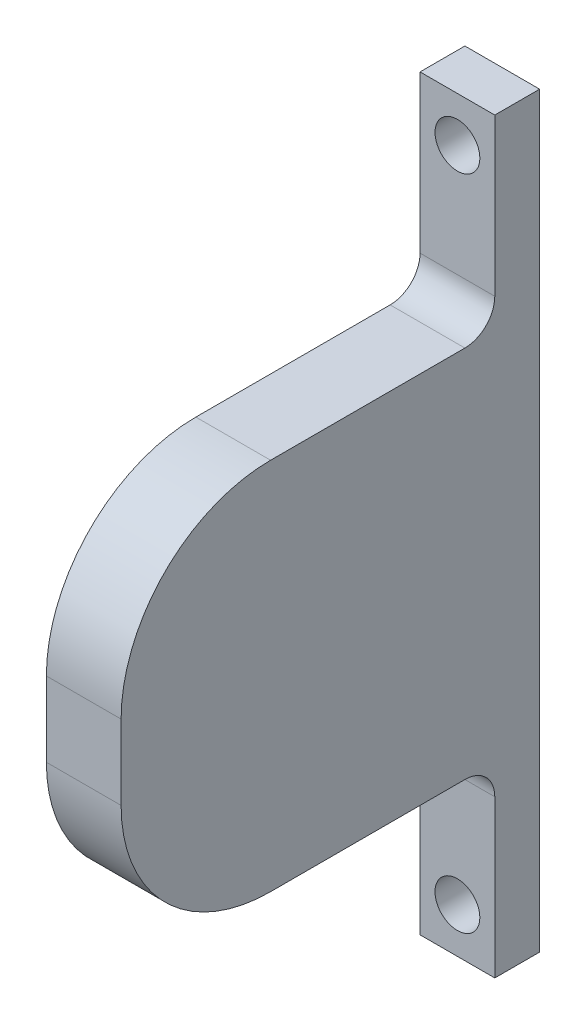
ISO-10303-21;
HEADER;
FILE_DESCRIPTION(('STEP AP214'),'2;1');
FILE_NAME('part.step','',(''),(''),'','','');
FILE_SCHEMA(('AUTOMOTIVE_DESIGN { 1 0 10303 214 1 1 1 1 }'));
ENDSEC;
DATA;
#1=APPLICATION_CONTEXT('core data for automotive mechanical design processes');
#2=APPLICATION_PROTOCOL_DEFINITION('international standard','automotive_design',2000,#1);
#3=PRODUCT_CONTEXT('',#1,'mechanical');
#4=PRODUCT('Part','Part','',(#3));
#5=PRODUCT_RELATED_PRODUCT_CATEGORY('part','',(#4));
#6=PRODUCT_DEFINITION_FORMATION('','',#4);
#7=PRODUCT_DEFINITION_CONTEXT('part definition',#1,'design');
#8=PRODUCT_DEFINITION('design','',#6,#7);
#9=PRODUCT_DEFINITION_SHAPE('','',#8);
#10=(LENGTH_UNIT() NAMED_UNIT(*) SI_UNIT(.MILLI.,.METRE.));
#11=(NAMED_UNIT(*) PLANE_ANGLE_UNIT() SI_UNIT($,.RADIAN.));
#12=(NAMED_UNIT(*) SI_UNIT($,.STERADIAN.) SOLID_ANGLE_UNIT());
#13=UNCERTAINTY_MEASURE_WITH_UNIT(LENGTH_MEASURE(1.E-05),#10,'distance_accuracy_value','');
#14=(GEOMETRIC_REPRESENTATION_CONTEXT(3) GLOBAL_UNCERTAINTY_ASSIGNED_CONTEXT((#13)) GLOBAL_UNIT_ASSIGNED_CONTEXT((#10,
#11,#12)) REPRESENTATION_CONTEXT('',''));
#15=CARTESIAN_POINT('',(0.,0.,0.));
#16=DIRECTION('',(0.,0.,1.));
#17=DIRECTION('',(1.,0.,0.));
#18=AXIS2_PLACEMENT_3D('',#15,#16,#17);
#19=CARTESIAN_POINT('',(5.,0.,0.));
#20=DIRECTION('',(0.,0.,-1.));
#21=DIRECTION('',(-1.,0.,0.));
#22=AXIS2_PLACEMENT_3D('',#19,#20,#21);
#23=PLANE('',#22);
#24=DIRECTION('',(0.,-1.,0.));
#25=VECTOR('',#24,1.);
#26=CARTESIAN_POINT('',(0.,0.,0.));
#27=LINE('',#26,#25);
#28=CARTESIAN_POINT('',(0.,15.,0.));
#29=VERTEX_POINT('',#28);
#30=CARTESIAN_POINT('',(0.,10.,0.));
#31=VERTEX_POINT('',#30);
#32=EDGE_CURVE('E173',#29,#31,#27,.T.);
#33=ORIENTED_EDGE('',*,*,#32,.T.);
#34=DIRECTION('',(-1.,0.,0.));
#35=VECTOR('',#34,1.);
#36=CARTESIAN_POINT('',(5.,10.,0.));
#37=LINE('',#36,#35);
#38=CARTESIAN_POINT('',(5.,10.,0.));
#39=VERTEX_POINT('',#38);
#40=EDGE_CURVE('E217',#31,#39,#37,.F.);
#41=ORIENTED_EDGE('',*,*,#40,.T.);
#42=DIRECTION('',(0.,-1.,0.));
#43=VECTOR('',#42,1.);
#44=CARTESIAN_POINT('',(5.,0.,0.));
#45=LINE('',#44,#43);
#46=CARTESIAN_POINT('',(5.,15.,0.));
#47=VERTEX_POINT('',#46);
#48=EDGE_CURVE('E191',#47,#39,#45,.T.);
#49=ORIENTED_EDGE('',*,*,#48,.F.);
#50=DIRECTION('',(-1.,0.,0.));
#51=VECTOR('',#50,1.);
#52=CARTESIAN_POINT('',(5.,15.,0.));
#53=LINE('',#52,#51);
#54=EDGE_CURVE('E214',#47,#29,#53,.T.);
#55=ORIENTED_EDGE('',*,*,#54,.T.);
#56=EDGE_LOOP('',(#33,#41,#49,#55));
#57=FACE_BOUND('',#56,.T.);
#58=ADVANCED_FACE('F45',(#57),#23,.F.);
#59=CARTESIAN_POINT('',(5.,0.,0.));
#60=DIRECTION('',(0.,1.,0.));
#61=DIRECTION('',(0.,0.,1.));
#62=AXIS2_PLACEMENT_3D('',#59,#60,#61);
#63=PLANE('',#62);
#64=DIRECTION('',(0.,0.,-1.));
#65=VECTOR('',#64,1.);
#66=CARTESIAN_POINT('',(0.,0.,0.));
#67=LINE('',#66,#65);
#68=CARTESIAN_POINT('',(0.,0.,-10.));
#69=VERTEX_POINT('',#68);
#70=CARTESIAN_POINT('',(0.,0.,-23.));
#71=VERTEX_POINT('',#70);
#72=EDGE_CURVE('E176',#69,#71,#67,.T.);
#73=ORIENTED_EDGE('',*,*,#72,.T.);
#74=DIRECTION('',(-1.,0.,0.));
#75=VECTOR('',#74,1.);
#76=CARTESIAN_POINT('',(5.,0.,-23.));
#77=LINE('',#76,#75);
#78=CARTESIAN_POINT('',(5.,0.,-23.));
#79=VERTEX_POINT('',#78);
#80=EDGE_CURVE('E228',#71,#79,#77,.F.);
#81=ORIENTED_EDGE('',*,*,#80,.T.);
#82=DIRECTION('',(0.,0.,-1.));
#83=VECTOR('',#82,1.);
#84=CARTESIAN_POINT('',(5.,0.,0.));
#85=LINE('',#84,#83);
#86=CARTESIAN_POINT('',(5.,0.,-10.));
#87=VERTEX_POINT('',#86);
#88=EDGE_CURVE('E146',#87,#79,#85,.T.);
#89=ORIENTED_EDGE('',*,*,#88,.F.);
#90=DIRECTION('',(-1.,0.,0.));
#91=VECTOR('',#90,1.);
#92=CARTESIAN_POINT('',(5.,0.,-10.));
#93=LINE('',#92,#91);
#94=EDGE_CURVE('E206',#87,#69,#93,.T.);
#95=ORIENTED_EDGE('',*,*,#94,.T.);
#96=EDGE_LOOP('',(#73,#81,#89,#95));
#97=FACE_BOUND('',#96,.T.);
#98=ADVANCED_FACE('F241',(#97),#63,.F.);
#99=CARTESIAN_POINT('',(5.,-12.5,-25.));
#100=DIRECTION('',(0.,0.,-1.));
#101=DIRECTION('',(-1.,0.,0.));
#102=AXIS2_PLACEMENT_3D('',#99,#100,#101);
#103=PLANE('',#102);
#104=CARTESIAN_POINT('',(2.5,-9.5,-25.));
#105=DIRECTION('',(0.,0.,1.));
#106=DIRECTION('',(-1.,0.,0.));
#107=AXIS2_PLACEMENT_3D('',#104,#105,#106);
#108=CIRCLE('',#107,1.5);
#109=CARTESIAN_POINT('',(1.,-9.5,-25.));
#110=VERTEX_POINT('',#109);
#111=EDGE_CURVE('E285',#110,#110,#108,.T.);
#112=ORIENTED_EDGE('',*,*,#111,.F.);
#113=EDGE_LOOP('',(#112));
#114=FACE_BOUND('',#113,.T.);
#115=DIRECTION('',(0.,-1.,0.));
#116=VECTOR('',#115,1.);
#117=CARTESIAN_POINT('',(5.,-12.5,-25.));
#118=LINE('',#117,#116);
#119=CARTESIAN_POINT('',(5.,-2.,-25.));
#120=VERTEX_POINT('',#119);
#121=CARTESIAN_POINT('',(5.,-12.5,-25.));
#122=VERTEX_POINT('',#121);
#123=EDGE_CURVE('E133',#120,#122,#118,.T.);
#124=ORIENTED_EDGE('',*,*,#123,.F.);
#125=DIRECTION('',(-1.,0.,0.));
#126=VECTOR('',#125,1.);
#127=CARTESIAN_POINT('',(0.,-2.,-25.));
#128=LINE('',#127,#126);
#129=CARTESIAN_POINT('',(0.,-2.,-25.));
#130=VERTEX_POINT('',#129);
#131=EDGE_CURVE('E226',#120,#130,#128,.T.);
#132=ORIENTED_EDGE('',*,*,#131,.T.);
#133=DIRECTION('',(0.,-1.,0.));
#134=VECTOR('',#133,1.);
#135=CARTESIAN_POINT('',(0.,-12.5,-25.));
#136=LINE('',#135,#134);
#137=CARTESIAN_POINT('',(0.,-12.5,-25.));
#138=VERTEX_POINT('',#137);
#139=EDGE_CURVE('E152',#130,#138,#136,.T.);
#140=ORIENTED_EDGE('',*,*,#139,.T.);
#141=DIRECTION('',(-1.,0.,0.));
#142=VECTOR('',#141,1.);
#143=CARTESIAN_POINT('',(5.,-12.5,-25.));
#144=LINE('',#143,#142);
#145=EDGE_CURVE('E149',#122,#138,#144,.T.);
#146=ORIENTED_EDGE('',*,*,#145,.F.);
#147=EDGE_LOOP('',(#124,#132,#140,#146));
#148=FACE_BOUND('',#147,.T.);
#149=ADVANCED_FACE('F150',(#114,#148),#103,.F.);
#150=CARTESIAN_POINT('',(5.,-12.5,-25.));
#151=DIRECTION('',(0.,1.,0.));
#152=DIRECTION('',(0.,0.,1.));
#153=AXIS2_PLACEMENT_3D('',#150,#151,#152);
#154=PLANE('',#153);
#155=DIRECTION('',(0.,0.,-1.));
#156=VECTOR('',#155,1.);
#157=CARTESIAN_POINT('',(0.,-12.5,-25.));
#158=LINE('',#157,#156);
#159=CARTESIAN_POINT('',(0.,-12.5,-28.));
#160=VERTEX_POINT('',#159);
#161=EDGE_CURVE('E181',#138,#160,#158,.T.);
#162=ORIENTED_EDGE('',*,*,#161,.T.);
#163=DIRECTION('',(-1.,0.,0.));
#164=VECTOR('',#163,1.);
#165=CARTESIAN_POINT('',(5.,-12.5,-28.));
#166=LINE('',#165,#164);
#167=CARTESIAN_POINT('',(5.,-12.5,-28.));
#168=VERTEX_POINT('',#167);
#169=EDGE_CURVE('E156',#168,#160,#166,.T.);
#170=ORIENTED_EDGE('',*,*,#169,.F.);
#171=DIRECTION('',(0.,0.,-1.));
#172=VECTOR('',#171,1.);
#173=CARTESIAN_POINT('',(5.,-12.5,-25.));
#174=LINE('',#173,#172);
#175=EDGE_CURVE('E138',#122,#168,#174,.T.);
#176=ORIENTED_EDGE('',*,*,#175,.F.);
#177=ORIENTED_EDGE('',*,*,#145,.T.);
#178=EDGE_LOOP('',(#162,#170,#176,#177));
#179=FACE_BOUND('',#178,.T.);
#180=ADVANCED_FACE('F158',(#179),#154,.F.);
#181=CARTESIAN_POINT('',(5.,-12.5,-28.));
#182=DIRECTION('',(0.,0.,1.));
#183=DIRECTION('',(1.,0.,0.));
#184=AXIS2_PLACEMENT_3D('',#181,#182,#183);
#185=PLANE('',#184);
#186=CARTESIAN_POINT('',(2.5,34.5,-28.));
#187=DIRECTION('',(0.,0.,1.));
#188=DIRECTION('',(1.,0.,0.));
#189=AXIS2_PLACEMENT_3D('',#186,#187,#188);
#190=CIRCLE('',#189,1.5);
#191=CARTESIAN_POINT('',(4.,34.5,-28.));
#192=VERTEX_POINT('',#191);
#193=EDGE_CURVE('E200',#192,#192,#190,.T.);
#194=ORIENTED_EDGE('',*,*,#193,.T.);
#195=EDGE_LOOP('',(#194));
#196=FACE_BOUND('',#195,.T.);
#197=CARTESIAN_POINT('',(2.5,-9.5,-28.));
#198=DIRECTION('',(0.,0.,1.));
#199=DIRECTION('',(1.,0.,0.));
#200=AXIS2_PLACEMENT_3D('',#197,#198,#199);
#201=CIRCLE('',#200,1.5);
#202=CARTESIAN_POINT('',(4.,-9.5,-28.));
#203=VERTEX_POINT('',#202);
#204=EDGE_CURVE('E177',#203,#203,#201,.T.);
#205=ORIENTED_EDGE('',*,*,#204,.T.);
#206=EDGE_LOOP('',(#205));
#207=FACE_BOUND('',#206,.T.);
#208=DIRECTION('',(0.,1.,0.));
#209=VECTOR('',#208,1.);
#210=CARTESIAN_POINT('',(0.,-12.5,-28.));
#211=LINE('',#210,#209);
#212=CARTESIAN_POINT('',(0.,37.5,-28.));
#213=VERTEX_POINT('',#212);
#214=EDGE_CURVE('E183',#160,#213,#211,.T.);
#215=ORIENTED_EDGE('',*,*,#214,.T.);
#216=DIRECTION('',(-1.,0.,0.));
#217=VECTOR('',#216,1.);
#218=CARTESIAN_POINT('',(5.,37.5,-28.));
#219=LINE('',#218,#217);
#220=CARTESIAN_POINT('',(5.,37.5,-28.));
#221=VERTEX_POINT('',#220);
#222=EDGE_CURVE('E194',#221,#213,#219,.T.);
#223=ORIENTED_EDGE('',*,*,#222,.F.);
#224=DIRECTION('',(0.,1.,0.));
#225=VECTOR('',#224,1.);
#226=CARTESIAN_POINT('',(5.,-12.5,-28.));
#227=LINE('',#226,#225);
#228=EDGE_CURVE('E161',#168,#221,#227,.T.);
#229=ORIENTED_EDGE('',*,*,#228,.F.);
#230=ORIENTED_EDGE('',*,*,#169,.T.);
#231=EDGE_LOOP('',(#215,#223,#229,#230));
#232=FACE_BOUND('',#231,.T.);
#233=ADVANCED_FACE('F327',(#196,#207,#232),#185,.F.);
#234=CARTESIAN_POINT('',(5.,37.5,-25.));
#235=DIRECTION('',(0.,-1.,0.));
#236=DIRECTION('',(0.,0.,-1.));
#237=AXIS2_PLACEMENT_3D('',#234,#235,#236);
#238=PLANE('',#237);
#239=DIRECTION('',(0.,0.,1.));
#240=VECTOR('',#239,1.);
#241=CARTESIAN_POINT('',(0.,37.5,-25.));
#242=LINE('',#241,#240);
#243=CARTESIAN_POINT('',(0.,37.5,-25.));
#244=VERTEX_POINT('',#243);
#245=EDGE_CURVE('E185',#213,#244,#242,.T.);
#246=ORIENTED_EDGE('',*,*,#245,.T.);
#247=DIRECTION('',(-1.,0.,0.));
#248=VECTOR('',#247,1.);
#249=CARTESIAN_POINT('',(5.,37.5,-25.));
#250=LINE('',#249,#248);
#251=CARTESIAN_POINT('',(5.,37.5,-25.));
#252=VERTEX_POINT('',#251);
#253=EDGE_CURVE('E172',#252,#244,#250,.T.);
#254=ORIENTED_EDGE('',*,*,#253,.F.);
#255=DIRECTION('',(0.,0.,1.));
#256=VECTOR('',#255,1.);
#257=CARTESIAN_POINT('',(5.,37.5,-25.));
#258=LINE('',#257,#256);
#259=EDGE_CURVE('E163',#221,#252,#258,.T.);
#260=ORIENTED_EDGE('',*,*,#259,.F.);
#261=ORIENTED_EDGE('',*,*,#222,.T.);
#262=EDGE_LOOP('',(#246,#254,#260,#261));
#263=FACE_BOUND('',#262,.T.);
#264=ADVANCED_FACE('F323',(#263),#238,.F.);
#265=CARTESIAN_POINT('',(5.,25.,-25.));
#266=DIRECTION('',(0.,0.,-1.));
#267=DIRECTION('',(-1.,0.,0.));
#268=AXIS2_PLACEMENT_3D('',#265,#266,#267);
#269=PLANE('',#268);
#270=CARTESIAN_POINT('',(2.5,34.5,-25.));
#271=DIRECTION('',(0.,0.,1.));
#272=DIRECTION('',(1.,0.,0.));
#273=AXIS2_PLACEMENT_3D('',#270,#271,#272);
#274=CIRCLE('',#273,1.5);
#275=CARTESIAN_POINT('',(4.,34.5,-25.));
#276=VERTEX_POINT('',#275);
#277=EDGE_CURVE('E284',#276,#276,#274,.T.);
#278=ORIENTED_EDGE('',*,*,#277,.F.);
#279=EDGE_LOOP('',(#278));
#280=FACE_BOUND('',#279,.T.);
#281=DIRECTION('',(0.,-1.,0.));
#282=VECTOR('',#281,1.);
#283=CARTESIAN_POINT('',(0.,25.,-25.));
#284=LINE('',#283,#282);
#285=CARTESIAN_POINT('',(0.,27.,-25.));
#286=VERTEX_POINT('',#285);
#287=EDGE_CURVE('E187',#244,#286,#284,.T.);
#288=ORIENTED_EDGE('',*,*,#287,.T.);
#289=DIRECTION('',(-1.,0.,0.));
#290=VECTOR('',#289,1.);
#291=CARTESIAN_POINT('',(5.,27.,-25.));
#292=LINE('',#291,#290);
#293=CARTESIAN_POINT('',(5.,27.,-25.));
#294=VERTEX_POINT('',#293);
#295=EDGE_CURVE('E60',#286,#294,#292,.F.);
#296=ORIENTED_EDGE('',*,*,#295,.T.);
#297=DIRECTION('',(0.,-1.,0.));
#298=VECTOR('',#297,1.);
#299=CARTESIAN_POINT('',(5.,25.,-25.));
#300=LINE('',#299,#298);
#301=EDGE_CURVE('E168',#252,#294,#300,.T.);
#302=ORIENTED_EDGE('',*,*,#301,.F.);
#303=ORIENTED_EDGE('',*,*,#253,.T.);
#304=EDGE_LOOP('',(#288,#296,#302,#303));
#305=FACE_BOUND('',#304,.T.);
#306=ADVANCED_FACE('F319',(#280,#305),#269,.F.);
#307=CARTESIAN_POINT('',(5.,25.,0.));
#308=DIRECTION('',(0.,-1.,0.));
#309=DIRECTION('',(0.,0.,-1.));
#310=AXIS2_PLACEMENT_3D('',#307,#308,#309);
#311=PLANE('',#310);
#312=DIRECTION('',(0.,0.,1.));
#313=VECTOR('',#312,1.);
#314=CARTESIAN_POINT('',(5.,25.,0.));
#315=LINE('',#314,#313);
#316=CARTESIAN_POINT('',(5.,25.,-23.));
#317=VERTEX_POINT('',#316);
#318=CARTESIAN_POINT('',(5.,25.,-10.));
#319=VERTEX_POINT('',#318);
#320=EDGE_CURVE('E170',#317,#319,#315,.T.);
#321=ORIENTED_EDGE('',*,*,#320,.F.);
#322=DIRECTION('',(-1.,0.,0.));
#323=VECTOR('',#322,1.);
#324=CARTESIAN_POINT('',(0.,25.,-23.));
#325=LINE('',#324,#323);
#326=CARTESIAN_POINT('',(0.,25.,-23.));
#327=VERTEX_POINT('',#326);
#328=EDGE_CURVE('E230',#317,#327,#325,.T.);
#329=ORIENTED_EDGE('',*,*,#328,.T.);
#330=DIRECTION('',(0.,0.,1.));
#331=VECTOR('',#330,1.);
#332=CARTESIAN_POINT('',(0.,25.,0.));
#333=LINE('',#332,#331);
#334=CARTESIAN_POINT('',(0.,25.,-10.));
#335=VERTEX_POINT('',#334);
#336=EDGE_CURVE('E189',#327,#335,#333,.T.);
#337=ORIENTED_EDGE('',*,*,#336,.T.);
#338=DIRECTION('',(-1.,0.,0.));
#339=VECTOR('',#338,1.);
#340=CARTESIAN_POINT('',(5.,25.,-10.));
#341=LINE('',#340,#339);
#342=EDGE_CURVE('E223',#335,#319,#341,.F.);
#343=ORIENTED_EDGE('',*,*,#342,.T.);
#344=EDGE_LOOP('',(#321,#329,#337,#343));
#345=FACE_BOUND('',#344,.T.);
#346=ADVANCED_FACE('F314',(#345),#311,.F.);
#347=CARTESIAN_POINT('',(5.,0.,0.));
#348=DIRECTION('',(-1.,0.,0.));
#349=DIRECTION('',(0.,0.,1.));
#350=AXIS2_PLACEMENT_3D('',#347,#348,#349);
#351=PLANE('',#350);
#352=ORIENTED_EDGE('',*,*,#48,.T.);
#353=CARTESIAN_POINT('',(5.,10.,-10.));
#354=DIRECTION('',(-1.,0.,0.));
#355=DIRECTION('',(0.,0.,1.));
#356=AXIS2_PLACEMENT_3D('',#353,#354,#355);
#357=CIRCLE('',#356,10.);
#358=EDGE_CURVE('E221',#39,#87,#357,.F.);
#359=ORIENTED_EDGE('',*,*,#358,.T.);
#360=ORIENTED_EDGE('',*,*,#88,.T.);
#361=CARTESIAN_POINT('',(5.,-2.,-23.));
#362=DIRECTION('',(-1.,0.,0.));
#363=DIRECTION('',(0.,0.,1.));
#364=AXIS2_PLACEMENT_3D('',#361,#362,#363);
#365=CIRCLE('',#364,2.);
#366=EDGE_CURVE('E142',#79,#120,#365,.T.);
#367=ORIENTED_EDGE('',*,*,#366,.T.);
#368=ORIENTED_EDGE('',*,*,#123,.T.);
#369=ORIENTED_EDGE('',*,*,#175,.T.);
#370=ORIENTED_EDGE('',*,*,#228,.T.);
#371=ORIENTED_EDGE('',*,*,#259,.T.);
#372=ORIENTED_EDGE('',*,*,#301,.T.);
#373=CARTESIAN_POINT('',(5.,27.,-23.));
#374=DIRECTION('',(-1.,0.,0.));
#375=DIRECTION('',(0.,0.,1.));
#376=AXIS2_PLACEMENT_3D('',#373,#374,#375);
#377=CIRCLE('',#376,2.);
#378=EDGE_CURVE('E11',#294,#317,#377,.T.);
#379=ORIENTED_EDGE('',*,*,#378,.T.);
#380=ORIENTED_EDGE('',*,*,#320,.T.);
#381=CARTESIAN_POINT('',(5.,15.,-10.));
#382=DIRECTION('',(-1.,0.,0.));
#383=DIRECTION('',(0.,0.,1.));
#384=AXIS2_PLACEMENT_3D('',#381,#382,#383);
#385=CIRCLE('',#384,10.);
#386=EDGE_CURVE('E219',#319,#47,#385,.F.);
#387=ORIENTED_EDGE('',*,*,#386,.T.);
#388=EDGE_LOOP('',(#352,#359,#360,#367,#368,#369,#370,#371,#372,#379,#380,#387));
#389=FACE_BOUND('',#388,.T.);
#390=ADVANCED_FACE('F136',(#389),#351,.F.);
#391=CARTESIAN_POINT('',(0.,0.,0.));
#392=DIRECTION('',(-1.,0.,0.));
#393=DIRECTION('',(0.,0.,1.));
#394=AXIS2_PLACEMENT_3D('',#391,#392,#393);
#395=PLANE('',#394);
#396=CARTESIAN_POINT('',(0.,12.5,-8.));
#397=DIRECTION('',(-1.,0.,0.));
#398=DIRECTION('',(0.,0.,1.));
#399=AXIS2_PLACEMENT_3D('',#396,#397,#398);
#400=CIRCLE('',#399,5.55000000000001);
#401=CARTESIAN_POINT('',(0.,12.5,-2.44999999999999));
#402=VERTEX_POINT('',#401);
#403=EDGE_CURVE('E203',#402,#402,#400,.F.);
#404=ORIENTED_EDGE('',*,*,#403,.T.);
#405=EDGE_LOOP('',(#404));
#406=FACE_BOUND('',#405,.T.);
#407=ORIENTED_EDGE('',*,*,#72,.F.);
#408=CARTESIAN_POINT('',(0.,10.,-10.));
#409=DIRECTION('',(-1.,0.,0.));
#410=DIRECTION('',(0.,0.,1.));
#411=AXIS2_PLACEMENT_3D('',#408,#409,#410);
#412=CIRCLE('',#411,10.);
#413=EDGE_CURVE('E212',#69,#31,#412,.T.);
#414=ORIENTED_EDGE('',*,*,#413,.T.);
#415=ORIENTED_EDGE('',*,*,#32,.F.);
#416=CARTESIAN_POINT('',(0.,15.,-10.));
#417=DIRECTION('',(-1.,0.,0.));
#418=DIRECTION('',(0.,0.,1.));
#419=AXIS2_PLACEMENT_3D('',#416,#417,#418);
#420=CIRCLE('',#419,10.);
#421=EDGE_CURVE('E209',#29,#335,#420,.T.);
#422=ORIENTED_EDGE('',*,*,#421,.T.);
#423=ORIENTED_EDGE('',*,*,#336,.F.);
#424=CARTESIAN_POINT('',(0.,27.,-23.));
#425=DIRECTION('',(-1.,0.,0.));
#426=DIRECTION('',(0.,0.,1.));
#427=AXIS2_PLACEMENT_3D('',#424,#425,#426);
#428=CIRCLE('',#427,2.);
#429=EDGE_CURVE('E53',#327,#286,#428,.F.);
#430=ORIENTED_EDGE('',*,*,#429,.T.);
#431=ORIENTED_EDGE('',*,*,#287,.F.);
#432=ORIENTED_EDGE('',*,*,#245,.F.);
#433=ORIENTED_EDGE('',*,*,#214,.F.);
#434=ORIENTED_EDGE('',*,*,#161,.F.);
#435=ORIENTED_EDGE('',*,*,#139,.F.);
#436=CARTESIAN_POINT('',(0.,-2.,-23.));
#437=DIRECTION('',(-1.,0.,0.));
#438=DIRECTION('',(0.,0.,1.));
#439=AXIS2_PLACEMENT_3D('',#436,#437,#438);
#440=CIRCLE('',#439,2.);
#441=EDGE_CURVE('E234',#130,#71,#440,.F.);
#442=ORIENTED_EDGE('',*,*,#441,.T.);
#443=EDGE_LOOP('',(#407,#414,#415,#422,#423,#430,#431,#432,#433,#434,#435,#442));
#444=FACE_BOUND('',#443,.T.);
#445=ADVANCED_FACE('F237',(#406,#444),#395,.T.);
#446=CARTESIAN_POINT('',(2.5,34.5,-29.));
#447=DIRECTION('',(0.,0.,1.));
#448=DIRECTION('',(1.,0.,0.));
#449=AXIS2_PLACEMENT_3D('',#446,#447,#448);
#450=CYLINDRICAL_SURFACE('',#449,1.5);
#451=ORIENTED_EDGE('',*,*,#277,.T.);
#452=EDGE_LOOP('',(#451));
#453=FACE_BOUND('',#452,.T.);
#454=ORIENTED_EDGE('',*,*,#193,.F.);
#455=EDGE_LOOP('',(#454));
#456=FACE_BOUND('',#455,.T.);
#457=ADVANCED_FACE('F305',(#453,#456),#450,.F.);
#458=CARTESIAN_POINT('',(2.5,-9.5,-29.));
#459=DIRECTION('',(0.,0.,1.));
#460=DIRECTION('',(1.,0.,0.));
#461=AXIS2_PLACEMENT_3D('',#458,#459,#460);
#462=CYLINDRICAL_SURFACE('',#461,1.5);
#463=ORIENTED_EDGE('',*,*,#111,.T.);
#464=EDGE_LOOP('',(#463));
#465=FACE_BOUND('',#464,.T.);
#466=ORIENTED_EDGE('',*,*,#204,.F.);
#467=EDGE_LOOP('',(#466));
#468=FACE_BOUND('',#467,.T.);
#469=ADVANCED_FACE('F297',(#465,#468),#462,.F.);
#470=CARTESIAN_POINT('',(3.,12.5,-8.));
#471=DIRECTION('',(-1.,0.,0.));
#472=DIRECTION('',(0.,0.,1.));
#473=AXIS2_PLACEMENT_3D('',#470,#471,#472);
#474=CYLINDRICAL_SURFACE('',#473,5.05);
#475=CARTESIAN_POINT('',(0.500000000000016,12.5,-8.));
#476=DIRECTION('',(-1.,0.,0.));
#477=DIRECTION('',(0.,0.,1.));
#478=AXIS2_PLACEMENT_3D('',#475,#476,#477);
#479=CIRCLE('',#478,5.05);
#480=CARTESIAN_POINT('',(0.500000000000016,12.5,-2.95));
#481=VERTEX_POINT('',#480);
#482=EDGE_CURVE('E155',#481,#481,#479,.T.);
#483=ORIENTED_EDGE('',*,*,#482,.T.);
#484=EDGE_LOOP('',(#483));
#485=FACE_BOUND('',#484,.T.);
#486=CARTESIAN_POINT('',(3.,12.5,-8.));
#487=DIRECTION('',(-1.,0.,0.));
#488=DIRECTION('',(0.,0.,1.));
#489=AXIS2_PLACEMENT_3D('',#486,#487,#488);
#490=CIRCLE('',#489,5.05);
#491=CARTESIAN_POINT('',(3.,12.5,-2.95));
#492=VERTEX_POINT('',#491);
#493=EDGE_CURVE('E288',#492,#492,#490,.T.);
#494=ORIENTED_EDGE('',*,*,#493,.F.);
#495=EDGE_LOOP('',(#494));
#496=FACE_BOUND('',#495,.T.);
#497=ADVANCED_FACE('F295',(#485,#496),#474,.F.);
#498=CARTESIAN_POINT('',(3.,12.5,-8.));
#499=DIRECTION('',(-1.,0.,0.));
#500=DIRECTION('',(0.,0.,1.));
#501=AXIS2_PLACEMENT_3D('',#498,#499,#500);
#502=PLANE('',#501);
#503=ORIENTED_EDGE('',*,*,#493,.T.);
#504=EDGE_LOOP('',(#503));
#505=FACE_BOUND('',#504,.T.);
#506=ADVANCED_FACE('F272',(#505),#502,.T.);
#507=CARTESIAN_POINT('',(0.500000000000016,12.5,-8.));
#508=DIRECTION('',(-1.,0.,0.));
#509=DIRECTION('',(0.,0.,1.));
#510=AXIS2_PLACEMENT_3D('',#507,#508,#509);
#511=CONICAL_SURFACE('',#510,5.05,0.785398163397445);
#512=ORIENTED_EDGE('',*,*,#403,.F.);
#513=EDGE_LOOP('',(#512));
#514=FACE_BOUND('',#513,.T.);
#515=ORIENTED_EDGE('',*,*,#482,.F.);
#516=EDGE_LOOP('',(#515));
#517=FACE_BOUND('',#516,.T.);
#518=ADVANCED_FACE('F268',(#514,#517),#511,.F.);
#519=CARTESIAN_POINT('',(5.,10.,-10.));
#520=DIRECTION('',(-1.,0.,0.));
#521=DIRECTION('',(0.,0.,1.));
#522=AXIS2_PLACEMENT_3D('',#519,#520,#521);
#523=CYLINDRICAL_SURFACE('',#522,10.);
#524=ORIENTED_EDGE('',*,*,#358,.F.);
#525=ORIENTED_EDGE('',*,*,#40,.F.);
#526=ORIENTED_EDGE('',*,*,#413,.F.);
#527=ORIENTED_EDGE('',*,*,#94,.F.);
#528=EDGE_LOOP('',(#524,#525,#526,#527));
#529=FACE_BOUND('',#528,.T.);
#530=ADVANCED_FACE('F253',(#529),#523,.T.);
#531=CARTESIAN_POINT('',(5.,15.,-10.));
#532=DIRECTION('',(-1.,0.,0.));
#533=DIRECTION('',(0.,0.,1.));
#534=AXIS2_PLACEMENT_3D('',#531,#532,#533);
#535=CYLINDRICAL_SURFACE('',#534,10.);
#536=ORIENTED_EDGE('',*,*,#386,.F.);
#537=ORIENTED_EDGE('',*,*,#342,.F.);
#538=ORIENTED_EDGE('',*,*,#421,.F.);
#539=ORIENTED_EDGE('',*,*,#54,.F.);
#540=EDGE_LOOP('',(#536,#537,#538,#539));
#541=FACE_BOUND('',#540,.T.);
#542=ADVANCED_FACE('F246',(#541),#535,.T.);
#543=CARTESIAN_POINT('',(5.,-2.,-23.));
#544=DIRECTION('',(1.,0.,0.));
#545=DIRECTION('',(0.,0.,-1.));
#546=AXIS2_PLACEMENT_3D('',#543,#544,#545);
#547=CYLINDRICAL_SURFACE('',#546,2.);
#548=ORIENTED_EDGE('',*,*,#366,.F.);
#549=ORIENTED_EDGE('',*,*,#80,.F.);
#550=ORIENTED_EDGE('',*,*,#441,.F.);
#551=ORIENTED_EDGE('',*,*,#131,.F.);
#552=EDGE_LOOP('',(#548,#549,#550,#551));
#553=FACE_BOUND('',#552,.T.);
#554=ADVANCED_FACE('F244',(#553),#547,.F.);
#555=CARTESIAN_POINT('',(5.,27.,-23.));
#556=DIRECTION('',(1.,0.,0.));
#557=DIRECTION('',(0.,0.,-1.));
#558=AXIS2_PLACEMENT_3D('',#555,#556,#557);
#559=CYLINDRICAL_SURFACE('',#558,2.);
#560=ORIENTED_EDGE('',*,*,#378,.F.);
#561=ORIENTED_EDGE('',*,*,#295,.F.);
#562=ORIENTED_EDGE('',*,*,#429,.F.);
#563=ORIENTED_EDGE('',*,*,#328,.F.);
#564=EDGE_LOOP('',(#560,#561,#562,#563));
#565=FACE_BOUND('',#564,.T.);
#566=ADVANCED_FACE('F47',(#565),#559,.F.);
#567=CLOSED_SHELL('',(#58,#98,#149,#180,#233,#264,#306,#346,#390,#445,#457,#469,#497,#506,#518,
#530,#542,#554,#566));
#568=MANIFOLD_SOLID_BREP('B2',#567);
#569=ADVANCED_BREP_SHAPE_REPRESENTATION('',(#18,#568),#14);
#570=SHAPE_DEFINITION_REPRESENTATION(#9,#569);
ENDSEC;
END-ISO-10303-21;
